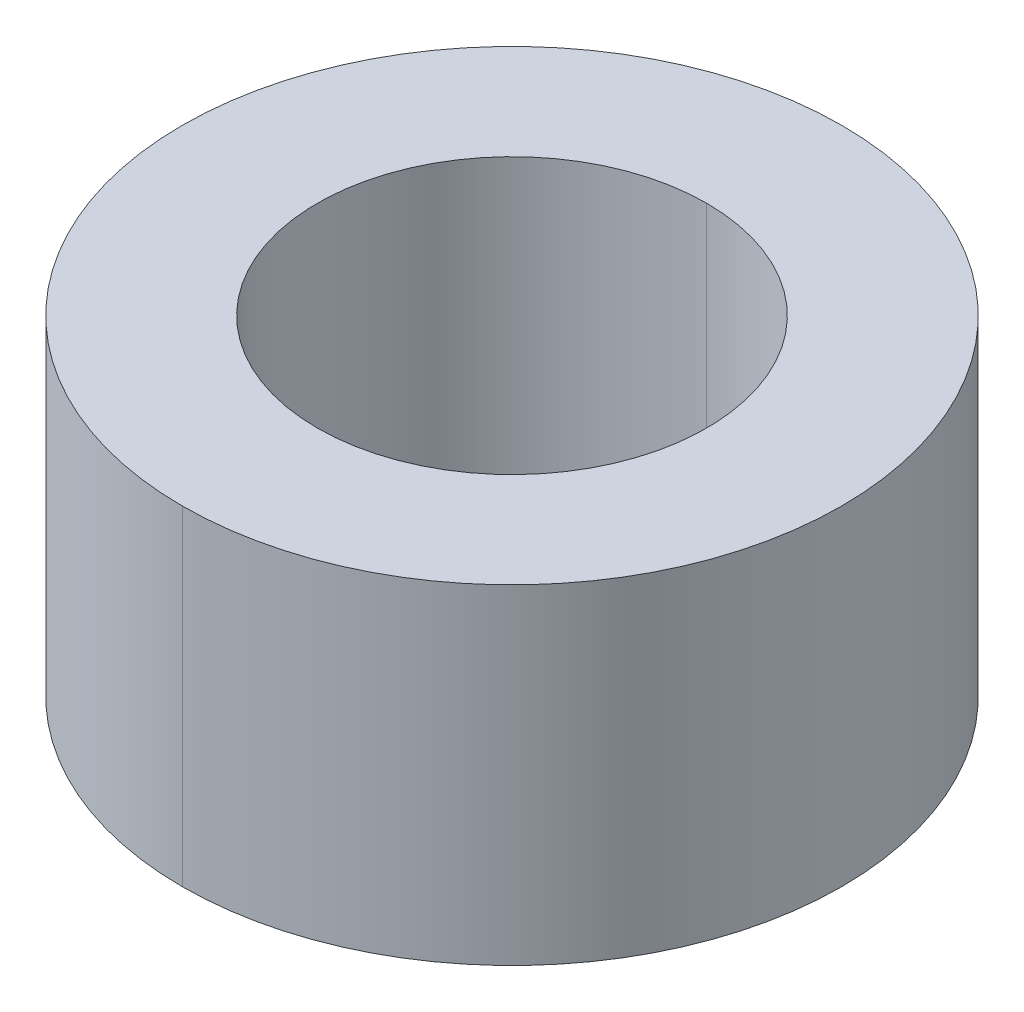
ISO-10303-21;
HEADER;
FILE_DESCRIPTION(('STEP AP214'),'2;1');
FILE_NAME('part.step','',(''),(''),'','','');
FILE_SCHEMA(('AUTOMOTIVE_DESIGN { 1 0 10303 214 1 1 1 1 }'));
ENDSEC;
DATA;
#1=APPLICATION_CONTEXT('core data for automotive mechanical design processes');
#2=APPLICATION_PROTOCOL_DEFINITION('international standard','automotive_design',2000,#1);
#3=PRODUCT_CONTEXT('',#1,'mechanical');
#4=PRODUCT('Part','Part','',(#3));
#5=PRODUCT_RELATED_PRODUCT_CATEGORY('part','',(#4));
#6=PRODUCT_DEFINITION_FORMATION('','',#4);
#7=PRODUCT_DEFINITION_CONTEXT('part definition',#1,'design');
#8=PRODUCT_DEFINITION('design','',#6,#7);
#9=PRODUCT_DEFINITION_SHAPE('','',#8);
#10=(LENGTH_UNIT() NAMED_UNIT(*) SI_UNIT(.MILLI.,.METRE.));
#11=(NAMED_UNIT(*) PLANE_ANGLE_UNIT() SI_UNIT($,.RADIAN.));
#12=(NAMED_UNIT(*) SI_UNIT($,.STERADIAN.) SOLID_ANGLE_UNIT());
#13=UNCERTAINTY_MEASURE_WITH_UNIT(LENGTH_MEASURE(1.E-05),#10,'distance_accuracy_value','');
#14=(GEOMETRIC_REPRESENTATION_CONTEXT(3) GLOBAL_UNCERTAINTY_ASSIGNED_CONTEXT((#13)) GLOBAL_UNIT_ASSIGNED_CONTEXT((#10,
#11,#12)) REPRESENTATION_CONTEXT('',''));
#15=CARTESIAN_POINT('',(0.,0.,0.));
#16=DIRECTION('',(0.,0.,1.));
#17=DIRECTION('',(1.,0.,0.));
#18=AXIS2_PLACEMENT_3D('',#15,#16,#17);
#19=CARTESIAN_POINT('',(0.,6.35,0.));
#20=DIRECTION('',(0.,-1.,0.));
#21=DIRECTION('',(0.,0.,-1.));
#22=AXIS2_PLACEMENT_3D('',#19,#20,#21);
#23=CYLINDRICAL_SURFACE('',#22,3.75);
#24=DIRECTION('',(0.,-1.,0.));
#25=VECTOR('',#24,1.);
#26=CARTESIAN_POINT('',(0.,6.35,3.75));
#27=LINE('',#26,#25);
#28=CARTESIAN_POINT('',(0.,6.35,3.75));
#29=VERTEX_POINT('',#28);
#30=CARTESIAN_POINT('',(0.,0.,3.75));
#31=VERTEX_POINT('',#30);
#32=EDGE_CURVE('E21',#29,#31,#27,.T.);
#33=ORIENTED_EDGE('',*,*,#32,.F.);
#34=CARTESIAN_POINT('',(0.,6.35,0.));
#35=DIRECTION('',(0.,1.,0.));
#36=DIRECTION('',(0.,0.,1.));
#37=AXIS2_PLACEMENT_3D('',#34,#35,#36);
#38=CIRCLE('',#37,3.75);
#39=CARTESIAN_POINT('',(0.,6.35,-3.75));
#40=VERTEX_POINT('',#39);
#41=EDGE_CURVE('E75',#29,#40,#38,.T.);
#42=ORIENTED_EDGE('',*,*,#41,.T.);
#43=DIRECTION('',(0.,-1.,0.));
#44=VECTOR('',#43,1.);
#45=CARTESIAN_POINT('',(0.,6.35,-3.75));
#46=LINE('',#45,#44);
#47=CARTESIAN_POINT('',(0.,0.,-3.75));
#48=VERTEX_POINT('',#47);
#49=EDGE_CURVE('E81',#40,#48,#46,.T.);
#50=ORIENTED_EDGE('',*,*,#49,.T.);
#51=CARTESIAN_POINT('',(0.,0.,0.));
#52=DIRECTION('',(0.,1.,0.));
#53=DIRECTION('',(0.,0.,1.));
#54=AXIS2_PLACEMENT_3D('',#51,#52,#53);
#55=CIRCLE('',#54,3.75);
#56=EDGE_CURVE('E11',#31,#48,#55,.T.);
#57=ORIENTED_EDGE('',*,*,#56,.F.);
#58=EDGE_LOOP('',(#33,#42,#50,#57));
#59=FACE_BOUND('',#58,.T.);
#60=ADVANCED_FACE('F17',(#59),#23,.F.);
#61=CARTESIAN_POINT('',(0.,6.35,0.));
#62=DIRECTION('',(0.,-1.,0.));
#63=DIRECTION('',(0.,0.,-1.));
#64=AXIS2_PLACEMENT_3D('',#61,#62,#63);
#65=CYLINDRICAL_SURFACE('',#64,6.35);
#66=DIRECTION('',(0.,-1.,0.));
#67=VECTOR('',#66,1.);
#68=CARTESIAN_POINT('',(0.,6.35,6.35));
#69=LINE('',#68,#67);
#70=CARTESIAN_POINT('',(0.,6.35,6.35));
#71=VERTEX_POINT('',#70);
#72=CARTESIAN_POINT('',(0.,0.,6.35));
#73=VERTEX_POINT('',#72);
#74=EDGE_CURVE('E108',#71,#73,#69,.T.);
#75=ORIENTED_EDGE('',*,*,#74,.F.);
#76=CARTESIAN_POINT('',(0.,6.35,0.));
#77=DIRECTION('',(0.,1.,0.));
#78=DIRECTION('',(0.,0.,1.));
#79=AXIS2_PLACEMENT_3D('',#76,#77,#78);
#80=CIRCLE('',#79,6.35);
#81=CARTESIAN_POINT('',(0.,6.35,-6.35));
#82=VERTEX_POINT('',#81);
#83=EDGE_CURVE('E86',#82,#71,#80,.T.);
#84=ORIENTED_EDGE('',*,*,#83,.F.);
#85=DIRECTION('',(0.,-1.,0.));
#86=VECTOR('',#85,1.);
#87=CARTESIAN_POINT('',(0.,6.35,-6.35));
#88=LINE('',#87,#86);
#89=CARTESIAN_POINT('',(0.,0.,-6.35));
#90=VERTEX_POINT('',#89);
#91=EDGE_CURVE('E103',#82,#90,#88,.T.);
#92=ORIENTED_EDGE('',*,*,#91,.T.);
#93=CARTESIAN_POINT('',(0.,0.,0.));
#94=DIRECTION('',(0.,1.,0.));
#95=DIRECTION('',(0.,0.,1.));
#96=AXIS2_PLACEMENT_3D('',#93,#94,#95);
#97=CIRCLE('',#96,6.35);
#98=EDGE_CURVE('E28',#90,#73,#97,.T.);
#99=ORIENTED_EDGE('',*,*,#98,.T.);
#100=EDGE_LOOP('',(#75,#84,#92,#99));
#101=FACE_BOUND('',#100,.T.);
#102=ADVANCED_FACE('F120',(#101),#65,.T.);
#103=CARTESIAN_POINT('',(0.,0.,0.));
#104=DIRECTION('',(0.,1.,0.));
#105=DIRECTION('',(1.,0.,0.));
#106=AXIS2_PLACEMENT_3D('',#103,#104,#105);
#107=PLANE('',#106);
#108=CARTESIAN_POINT('',(0.,0.,0.));
#109=DIRECTION('',(0.,1.,0.));
#110=DIRECTION('',(0.,0.,1.));
#111=AXIS2_PLACEMENT_3D('',#108,#109,#110);
#112=CIRCLE('',#111,3.75);
#113=EDGE_CURVE('E91',#48,#31,#112,.T.);
#114=ORIENTED_EDGE('',*,*,#113,.T.);
#115=ORIENTED_EDGE('',*,*,#56,.T.);
#116=EDGE_LOOP('',(#114,#115));
#117=FACE_BOUND('',#116,.T.);
#118=ORIENTED_EDGE('',*,*,#98,.F.);
#119=CARTESIAN_POINT('',(0.,0.,0.));
#120=DIRECTION('',(0.,1.,0.));
#121=DIRECTION('',(0.,0.,1.));
#122=AXIS2_PLACEMENT_3D('',#119,#120,#121);
#123=CIRCLE('',#122,6.35);
#124=EDGE_CURVE('E104',#73,#90,#123,.T.);
#125=ORIENTED_EDGE('',*,*,#124,.F.);
#126=EDGE_LOOP('',(#118,#125));
#127=FACE_BOUND('',#126,.T.);
#128=ADVANCED_FACE('F125',(#117,#127),#107,.F.);
#129=CARTESIAN_POINT('',(0.,6.35,0.));
#130=DIRECTION('',(0.,1.,0.));
#131=DIRECTION('',(1.,0.,0.));
#132=AXIS2_PLACEMENT_3D('',#129,#130,#131);
#133=PLANE('',#132);
#134=CARTESIAN_POINT('',(0.,6.35,0.));
#135=DIRECTION('',(0.,1.,0.));
#136=DIRECTION('',(0.,0.,1.));
#137=AXIS2_PLACEMENT_3D('',#134,#135,#136);
#138=CIRCLE('',#137,3.75);
#139=EDGE_CURVE('E90',#40,#29,#138,.T.);
#140=ORIENTED_EDGE('',*,*,#139,.F.);
#141=ORIENTED_EDGE('',*,*,#41,.F.);
#142=EDGE_LOOP('',(#140,#141));
#143=FACE_BOUND('',#142,.T.);
#144=ORIENTED_EDGE('',*,*,#83,.T.);
#145=CARTESIAN_POINT('',(0.,6.35,0.));
#146=DIRECTION('',(0.,1.,0.));
#147=DIRECTION('',(0.,0.,1.));
#148=AXIS2_PLACEMENT_3D('',#145,#146,#147);
#149=CIRCLE('',#148,6.35);
#150=EDGE_CURVE('E93',#71,#82,#149,.T.);
#151=ORIENTED_EDGE('',*,*,#150,.T.);
#152=EDGE_LOOP('',(#144,#151));
#153=FACE_BOUND('',#152,.T.);
#154=ADVANCED_FACE('F19',(#143,#153),#133,.T.);
#155=CARTESIAN_POINT('',(0.,6.35,0.));
#156=DIRECTION('',(0.,-1.,0.));
#157=DIRECTION('',(0.,0.,-1.));
#158=AXIS2_PLACEMENT_3D('',#155,#156,#157);
#159=CYLINDRICAL_SURFACE('',#158,6.35);
#160=ORIENTED_EDGE('',*,*,#150,.F.);
#161=ORIENTED_EDGE('',*,*,#74,.T.);
#162=ORIENTED_EDGE('',*,*,#124,.T.);
#163=ORIENTED_EDGE('',*,*,#91,.F.);
#164=EDGE_LOOP('',(#160,#161,#162,#163));
#165=FACE_BOUND('',#164,.T.);
#166=ADVANCED_FACE('F124',(#165),#159,.T.);
#167=CARTESIAN_POINT('',(0.,6.35,0.));
#168=DIRECTION('',(0.,-1.,0.));
#169=DIRECTION('',(0.,0.,-1.));
#170=AXIS2_PLACEMENT_3D('',#167,#168,#169);
#171=CYLINDRICAL_SURFACE('',#170,3.75);
#172=ORIENTED_EDGE('',*,*,#139,.T.);
#173=ORIENTED_EDGE('',*,*,#32,.T.);
#174=ORIENTED_EDGE('',*,*,#113,.F.);
#175=ORIENTED_EDGE('',*,*,#49,.F.);
#176=EDGE_LOOP('',(#172,#173,#174,#175));
#177=FACE_BOUND('',#176,.T.);
#178=ADVANCED_FACE('F89',(#177),#171,.F.);
#179=CLOSED_SHELL('',(#60,#102,#128,#154,#166,#178));
#180=MANIFOLD_SOLID_BREP('B1',#179);
#181=ADVANCED_BREP_SHAPE_REPRESENTATION('',(#18,#180),#14);
#182=SHAPE_DEFINITION_REPRESENTATION(#9,#181);
ENDSEC;
END-ISO-10303-21;
